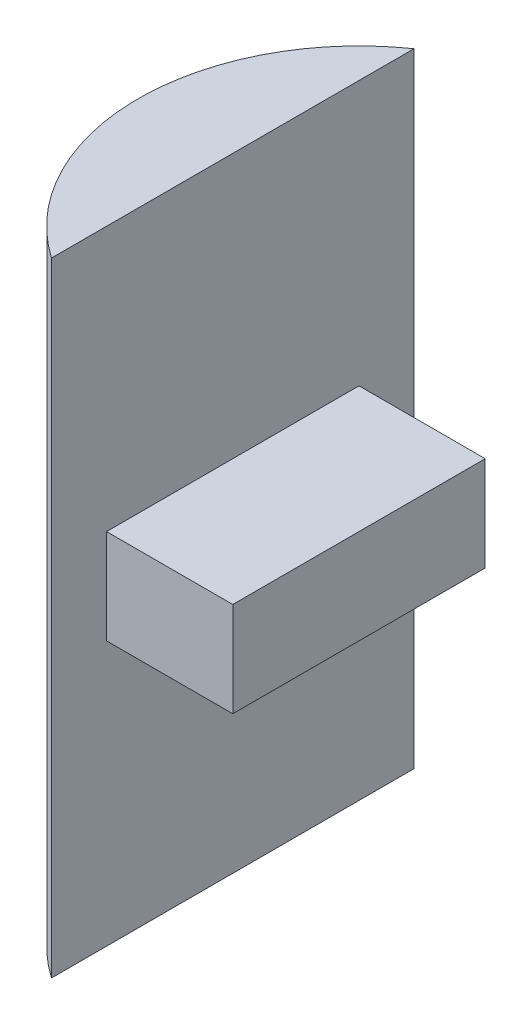
ISO-10303-21;
HEADER;
FILE_DESCRIPTION(('STEP AP214'),'2;1');
FILE_NAME('part.step','',(''),(''),'','','');
FILE_SCHEMA(('AUTOMOTIVE_DESIGN { 1 0 10303 214 1 1 1 1 }'));
ENDSEC;
DATA;
#1=APPLICATION_CONTEXT('core data for automotive mechanical design processes');
#2=APPLICATION_PROTOCOL_DEFINITION('international standard','automotive_design',2000,#1);
#3=PRODUCT_CONTEXT('',#1,'mechanical');
#4=PRODUCT('Part','Part','',(#3));
#5=PRODUCT_RELATED_PRODUCT_CATEGORY('part','',(#4));
#6=PRODUCT_DEFINITION_FORMATION('','',#4);
#7=PRODUCT_DEFINITION_CONTEXT('part definition',#1,'design');
#8=PRODUCT_DEFINITION('design','',#6,#7);
#9=PRODUCT_DEFINITION_SHAPE('','',#8);
#10=(LENGTH_UNIT() NAMED_UNIT(*) SI_UNIT(.MILLI.,.METRE.));
#11=(NAMED_UNIT(*) PLANE_ANGLE_UNIT() SI_UNIT($,.RADIAN.));
#12=(NAMED_UNIT(*) SI_UNIT($,.STERADIAN.) SOLID_ANGLE_UNIT());
#13=UNCERTAINTY_MEASURE_WITH_UNIT(LENGTH_MEASURE(1.E-05),#10,'distance_accuracy_value','');
#14=(GEOMETRIC_REPRESENTATION_CONTEXT(3) GLOBAL_UNCERTAINTY_ASSIGNED_CONTEXT((#13)) GLOBAL_UNIT_ASSIGNED_CONTEXT((#10,
#11,#12)) REPRESENTATION_CONTEXT('',''));
#15=CARTESIAN_POINT('',(0.,0.,0.));
#16=DIRECTION('',(0.,0.,1.));
#17=DIRECTION('',(1.,0.,0.));
#18=AXIS2_PLACEMENT_3D('',#15,#16,#17);
#19=CARTESIAN_POINT('',(-2.,16.88,-3.5));
#20=DIRECTION('',(-1.,0.,0.));
#21=DIRECTION('',(0.,-1.,0.));
#22=AXIS2_PLACEMENT_3D('',#19,#20,#21);
#23=PLANE('',#22);
#24=DIRECTION('',(0.,0.,1.));
#25=VECTOR('',#24,1.);
#26=CARTESIAN_POINT('',(-2.,16.88,-3.5));
#27=LINE('',#26,#25);
#28=CARTESIAN_POINT('',(-2.,16.88,-2.87228132326901));
#29=VERTEX_POINT('',#28);
#30=CARTESIAN_POINT('',(-2.,16.88,2.87228132326901));
#31=VERTEX_POINT('',#30);
#32=EDGE_CURVE('E115',#29,#31,#27,.T.);
#33=ORIENTED_EDGE('',*,*,#32,.T.);
#34=DIRECTION('',(0.,-1.,0.));
#35=VECTOR('',#34,1.);
#36=CARTESIAN_POINT('',(-2.,16.88,2.87228132326901));
#37=LINE('',#36,#35);
#38=CARTESIAN_POINT('',(-2.,7.,2.87228132326902));
#39=VERTEX_POINT('',#38);
#40=EDGE_CURVE('E136',#39,#31,#37,.F.);
#41=ORIENTED_EDGE('',*,*,#40,.F.);
#42=DIRECTION('',(0.,0.,1.));
#43=VECTOR('',#42,1.);
#44=CARTESIAN_POINT('',(-2.,7.,0.));
#45=LINE('',#44,#43);
#46=CARTESIAN_POINT('',(-2.,7.,-2.87228132326902));
#47=VERTEX_POINT('',#46);
#48=EDGE_CURVE('E12',#47,#39,#45,.T.);
#49=ORIENTED_EDGE('',*,*,#48,.F.);
#50=DIRECTION('',(0.,-1.,0.));
#51=VECTOR('',#50,1.);
#52=CARTESIAN_POINT('',(-2.,16.88,-2.87228132326901));
#53=LINE('',#52,#51);
#54=EDGE_CURVE('E139',#29,#47,#53,.T.);
#55=ORIENTED_EDGE('',*,*,#54,.F.);
#56=EDGE_LOOP('',(#33,#41,#49,#55));
#57=FACE_BOUND('',#56,.T.);
#58=DIRECTION('',(0.,0.,1.));
#59=VECTOR('',#58,1.);
#60=CARTESIAN_POINT('',(-2.,12.69,-3.5));
#61=LINE('',#60,#59);
#62=CARTESIAN_POINT('',(-2.,12.69,-2.));
#63=VERTEX_POINT('',#62);
#64=CARTESIAN_POINT('',(-2.,12.69,2.));
#65=VERTEX_POINT('',#64);
#66=EDGE_CURVE('E113',#63,#65,#61,.T.);
#67=ORIENTED_EDGE('',*,*,#66,.F.);
#68=DIRECTION('',(0.,1.,0.));
#69=VECTOR('',#68,1.);
#70=CARTESIAN_POINT('',(-2.,16.88,-2.));
#71=LINE('',#70,#69);
#72=CARTESIAN_POINT('',(-2.,11.19,-2.));
#73=VERTEX_POINT('',#72);
#74=EDGE_CURVE('E108',#73,#63,#71,.T.);
#75=ORIENTED_EDGE('',*,*,#74,.F.);
#76=DIRECTION('',(0.,0.,1.));
#77=VECTOR('',#76,1.);
#78=CARTESIAN_POINT('',(-2.,11.19,-3.5));
#79=LINE('',#78,#77);
#80=CARTESIAN_POINT('',(-2.,11.19,2.));
#81=VERTEX_POINT('',#80);
#82=EDGE_CURVE('E64',#73,#81,#79,.T.);
#83=ORIENTED_EDGE('',*,*,#82,.T.);
#84=DIRECTION('',(0.,1.,0.));
#85=VECTOR('',#84,1.);
#86=CARTESIAN_POINT('',(-2.,16.88,2.));
#87=LINE('',#86,#85);
#88=EDGE_CURVE('E59',#81,#65,#87,.T.);
#89=ORIENTED_EDGE('',*,*,#88,.T.);
#90=EDGE_LOOP('',(#67,#75,#83,#89));
#91=FACE_BOUND('',#90,.T.);
#92=ADVANCED_FACE('F44',(#57,#91),#23,.F.);
#93=CARTESIAN_POINT('',(0.,16.88,0.));
#94=DIRECTION('',(0.,-1.,0.));
#95=DIRECTION('',(0.,0.,-1.));
#96=AXIS2_PLACEMENT_3D('',#93,#94,#95);
#97=CYLINDRICAL_SURFACE('',#96,3.5);
#98=CARTESIAN_POINT('',(0.,16.88,0.));
#99=DIRECTION('',(0.,1.,0.));
#100=DIRECTION('',(0.,0.,1.));
#101=AXIS2_PLACEMENT_3D('',#98,#99,#100);
#102=CIRCLE('',#101,3.5);
#103=EDGE_CURVE('E52',#29,#31,#102,.T.);
#104=ORIENTED_EDGE('',*,*,#103,.F.);
#105=ORIENTED_EDGE('',*,*,#54,.T.);
#106=CARTESIAN_POINT('',(0.,7.,0.));
#107=DIRECTION('',(0.,1.,0.));
#108=DIRECTION('',(0.,0.,1.));
#109=AXIS2_PLACEMENT_3D('',#106,#107,#108);
#110=CIRCLE('',#109,3.5);
#111=EDGE_CURVE('E142',#47,#39,#110,.T.);
#112=ORIENTED_EDGE('',*,*,#111,.T.);
#113=ORIENTED_EDGE('',*,*,#40,.T.);
#114=EDGE_LOOP('',(#104,#105,#112,#113));
#115=FACE_BOUND('',#114,.T.);
#116=ADVANCED_FACE('F46',(#115),#97,.T.);
#117=CARTESIAN_POINT('',(0.,16.88,0.));
#118=DIRECTION('',(0.,1.,0.));
#119=DIRECTION('',(0.,0.,1.));
#120=AXIS2_PLACEMENT_3D('',#117,#118,#119);
#121=PLANE('',#120);
#122=ORIENTED_EDGE('',*,*,#32,.F.);
#123=ORIENTED_EDGE('',*,*,#103,.T.);
#124=EDGE_LOOP('',(#122,#123));
#125=FACE_BOUND('',#124,.T.);
#126=ADVANCED_FACE('F153',(#125),#121,.T.);
#127=CARTESIAN_POINT('',(0.,7.,0.));
#128=DIRECTION('',(0.,1.,0.));
#129=DIRECTION('',(0.,0.,1.));
#130=AXIS2_PLACEMENT_3D('',#127,#128,#129);
#131=PLANE('',#130);
#132=ORIENTED_EDGE('',*,*,#111,.F.);
#133=ORIENTED_EDGE('',*,*,#48,.T.);
#134=EDGE_LOOP('',(#132,#133));
#135=FACE_BOUND('',#134,.T.);
#136=ADVANCED_FACE('F149',(#135),#131,.F.);
#137=CARTESIAN_POINT('',(0.,12.69,-3.5));
#138=DIRECTION('',(0.,-1.,0.));
#139=DIRECTION('',(0.,0.,-1.));
#140=AXIS2_PLACEMENT_3D('',#137,#138,#139);
#141=PLANE('',#140);
#142=ORIENTED_EDGE('',*,*,#66,.T.);
#143=DIRECTION('',(-1.,0.,0.));
#144=VECTOR('',#143,1.);
#145=CARTESIAN_POINT('',(0.,12.69,2.));
#146=LINE('',#145,#144);
#147=CARTESIAN_POINT('',(0.,12.69,2.));
#148=VERTEX_POINT('',#147);
#149=EDGE_CURVE('E111',#148,#65,#146,.T.);
#150=ORIENTED_EDGE('',*,*,#149,.F.);
#151=DIRECTION('',(0.,0.,1.));
#152=VECTOR('',#151,1.);
#153=CARTESIAN_POINT('',(0.,12.69,-3.5));
#154=LINE('',#153,#152);
#155=CARTESIAN_POINT('',(0.,12.69,-2.));
#156=VERTEX_POINT('',#155);
#157=EDGE_CURVE('E96',#156,#148,#154,.T.);
#158=ORIENTED_EDGE('',*,*,#157,.F.);
#159=DIRECTION('',(-1.,0.,0.));
#160=VECTOR('',#159,1.);
#161=CARTESIAN_POINT('',(0.,12.69,-2.));
#162=LINE('',#161,#160);
#163=EDGE_CURVE('E124',#156,#63,#162,.T.);
#164=ORIENTED_EDGE('',*,*,#163,.T.);
#165=EDGE_LOOP('',(#142,#150,#158,#164));
#166=FACE_BOUND('',#165,.T.);
#167=ADVANCED_FACE('F112',(#166),#141,.F.);
#168=CARTESIAN_POINT('',(0.,16.88,2.));
#169=DIRECTION('',(0.,0.,1.));
#170=DIRECTION('',(1.,0.,0.));
#171=AXIS2_PLACEMENT_3D('',#168,#169,#170);
#172=PLANE('',#171);
#173=ORIENTED_EDGE('',*,*,#88,.F.);
#174=DIRECTION('',(-1.,0.,0.));
#175=VECTOR('',#174,1.);
#176=CARTESIAN_POINT('',(0.,11.19,2.));
#177=LINE('',#176,#175);
#178=CARTESIAN_POINT('',(0.,11.19,2.));
#179=VERTEX_POINT('',#178);
#180=EDGE_CURVE('E116',#179,#81,#177,.T.);
#181=ORIENTED_EDGE('',*,*,#180,.F.);
#182=DIRECTION('',(0.,1.,0.));
#183=VECTOR('',#182,1.);
#184=CARTESIAN_POINT('',(0.,16.88,2.));
#185=LINE('',#184,#183);
#186=EDGE_CURVE('E101',#179,#148,#185,.T.);
#187=ORIENTED_EDGE('',*,*,#186,.T.);
#188=ORIENTED_EDGE('',*,*,#149,.T.);
#189=EDGE_LOOP('',(#173,#181,#187,#188));
#190=FACE_BOUND('',#189,.T.);
#191=ADVANCED_FACE('F118',(#190),#172,.T.);
#192=CARTESIAN_POINT('',(0.,11.19,-3.5));
#193=DIRECTION('',(0.,-1.,0.));
#194=DIRECTION('',(0.,0.,-1.));
#195=AXIS2_PLACEMENT_3D('',#192,#193,#194);
#196=PLANE('',#195);
#197=ORIENTED_EDGE('',*,*,#82,.F.);
#198=DIRECTION('',(-1.,0.,0.));
#199=VECTOR('',#198,1.);
#200=CARTESIAN_POINT('',(0.,11.19,-2.));
#201=LINE('',#200,#199);
#202=CARTESIAN_POINT('',(0.,11.19,-2.));
#203=VERTEX_POINT('',#202);
#204=EDGE_CURVE('E131',#203,#73,#201,.T.);
#205=ORIENTED_EDGE('',*,*,#204,.F.);
#206=DIRECTION('',(0.,0.,1.));
#207=VECTOR('',#206,1.);
#208=CARTESIAN_POINT('',(0.,11.19,-3.5));
#209=LINE('',#208,#207);
#210=EDGE_CURVE('E119',#203,#179,#209,.T.);
#211=ORIENTED_EDGE('',*,*,#210,.T.);
#212=ORIENTED_EDGE('',*,*,#180,.T.);
#213=EDGE_LOOP('',(#197,#205,#211,#212));
#214=FACE_BOUND('',#213,.T.);
#215=ADVANCED_FACE('F169',(#214),#196,.T.);
#216=CARTESIAN_POINT('',(0.,16.88,-2.));
#217=DIRECTION('',(0.,0.,1.));
#218=DIRECTION('',(1.,0.,0.));
#219=AXIS2_PLACEMENT_3D('',#216,#217,#218);
#220=PLANE('',#219);
#221=ORIENTED_EDGE('',*,*,#74,.T.);
#222=ORIENTED_EDGE('',*,*,#163,.F.);
#223=DIRECTION('',(0.,1.,0.));
#224=VECTOR('',#223,1.);
#225=CARTESIAN_POINT('',(0.,16.88,-2.));
#226=LINE('',#225,#224);
#227=EDGE_CURVE('E104',#203,#156,#226,.T.);
#228=ORIENTED_EDGE('',*,*,#227,.F.);
#229=ORIENTED_EDGE('',*,*,#204,.T.);
#230=EDGE_LOOP('',(#221,#222,#228,#229));
#231=FACE_BOUND('',#230,.T.);
#232=ADVANCED_FACE('F172',(#231),#220,.F.);
#233=CARTESIAN_POINT('',(0.,0.,0.));
#234=DIRECTION('',(-1.,0.,0.));
#235=DIRECTION('',(0.,-1.,0.));
#236=AXIS2_PLACEMENT_3D('',#233,#234,#235);
#237=PLANE('',#236);
#238=ORIENTED_EDGE('',*,*,#157,.T.);
#239=ORIENTED_EDGE('',*,*,#186,.F.);
#240=ORIENTED_EDGE('',*,*,#210,.F.);
#241=ORIENTED_EDGE('',*,*,#227,.T.);
#242=EDGE_LOOP('',(#238,#239,#240,#241));
#243=FACE_BOUND('',#242,.T.);
#244=ADVANCED_FACE('F98',(#243),#237,.F.);
#245=CLOSED_SHELL('',(#92,#116,#126,#136,#167,#191,#215,#232,#244));
#246=MANIFOLD_SOLID_BREP('B2',#245);
#247=ADVANCED_BREP_SHAPE_REPRESENTATION('',(#18,#246),#14);
#248=SHAPE_DEFINITION_REPRESENTATION(#9,#247);
ENDSEC;
END-ISO-10303-21;
